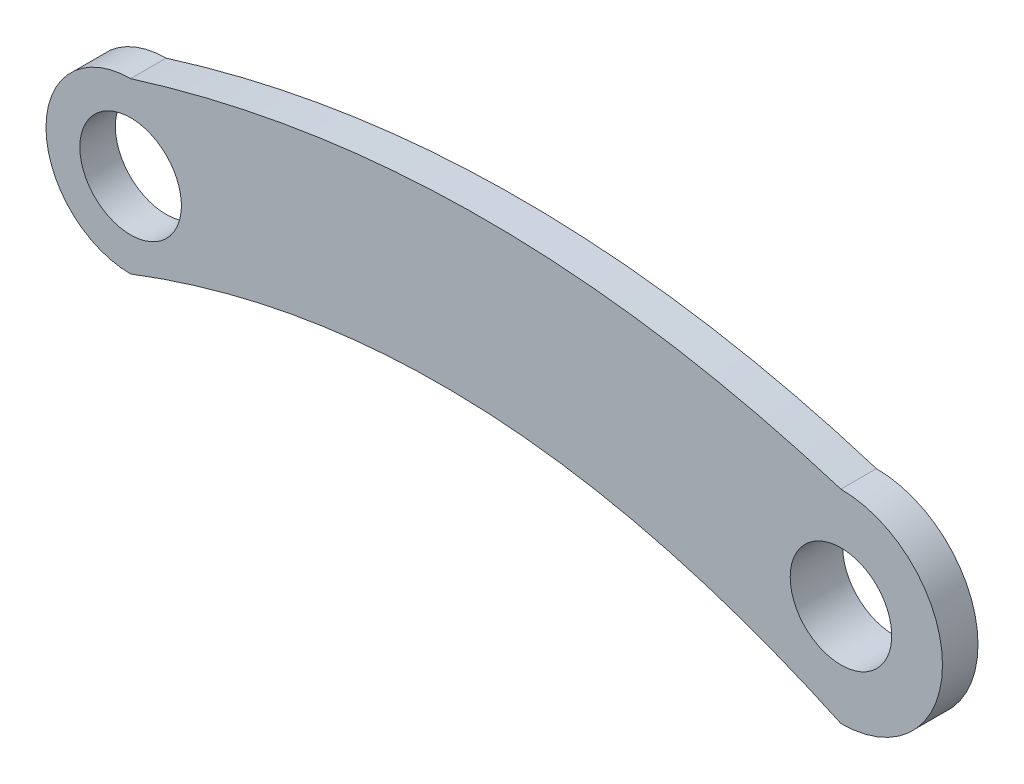
ISO-10303-21;
HEADER;
FILE_DESCRIPTION(('STEP AP214'),'2;1');
FILE_NAME('part.step','',(''),(''),'','','');
FILE_SCHEMA(('AUTOMOTIVE_DESIGN { 1 0 10303 214 1 1 1 1 }'));
ENDSEC;
DATA;
#1=APPLICATION_CONTEXT('core data for automotive mechanical design processes');
#2=APPLICATION_PROTOCOL_DEFINITION('international standard','automotive_design',2000,#1);
#3=PRODUCT_CONTEXT('',#1,'mechanical');
#4=PRODUCT('Part','Part','',(#3));
#5=PRODUCT_RELATED_PRODUCT_CATEGORY('part','',(#4));
#6=PRODUCT_DEFINITION_FORMATION('','',#4);
#7=PRODUCT_DEFINITION_CONTEXT('part definition',#1,'design');
#8=PRODUCT_DEFINITION('design','',#6,#7);
#9=PRODUCT_DEFINITION_SHAPE('','',#8);
#10=(LENGTH_UNIT() NAMED_UNIT(*) SI_UNIT(.MILLI.,.METRE.));
#11=(NAMED_UNIT(*) PLANE_ANGLE_UNIT() SI_UNIT($,.RADIAN.));
#12=(NAMED_UNIT(*) SI_UNIT($,.STERADIAN.) SOLID_ANGLE_UNIT());
#13=UNCERTAINTY_MEASURE_WITH_UNIT(LENGTH_MEASURE(1.E-05),#10,'distance_accuracy_value','');
#14=(GEOMETRIC_REPRESENTATION_CONTEXT(3) GLOBAL_UNCERTAINTY_ASSIGNED_CONTEXT((#13)) GLOBAL_UNIT_ASSIGNED_CONTEXT((#10,
#11,#12)) REPRESENTATION_CONTEXT('',''));
#15=CARTESIAN_POINT('',(0.,0.,0.));
#16=DIRECTION('',(0.,0.,1.));
#17=DIRECTION('',(1.,0.,0.));
#18=AXIS2_PLACEMENT_3D('',#15,#16,#17);
#19=CARTESIAN_POINT('',(0.,0.,0.));
#20=DIRECTION('',(0.,0.,1.));
#21=DIRECTION('',(1.,0.,0.));
#22=AXIS2_PLACEMENT_3D('',#19,#20,#21);
#23=PLANE('',#22);
#24=CARTESIAN_POINT('',(-267.733324074029,336.480114093346,0.));
#25=DIRECTION('',(0.,0.,1.));
#26=DIRECTION('',(1.,0.,0.));
#27=AXIS2_PLACEMENT_3D('',#24,#25,#26);
#28=CIRCLE('',#27,50.);
#29=CARTESIAN_POINT('',(-267.733324074029,386.480114093346,0.));
#30=VERTEX_POINT('',#29);
#31=CARTESIAN_POINT('',(-267.733324074029,286.480114093346,0.));
#32=VERTEX_POINT('',#31);
#33=EDGE_CURVE('E126',#30,#32,#28,.T.);
#34=ORIENTED_EDGE('',*,*,#33,.F.);
#35=CARTESIAN_POINT('',(-267.733324074029,386.480114093346,0.));
#36=CARTESIAN_POINT('',(-58.3768927784346,451.865914160474,0.));
#37=CARTESIAN_POINT('',(152.142574226651,386.270803333194,0.));
#38=B_SPLINE_CURVE_WITH_KNOTS('',2,(#35,#36,#37),.UNSPECIFIED.,.F.,.F.,(3,3),(0.,1.),.UNSPECIFIED.);
#39=CARTESIAN_POINT('',(152.142574226651,386.270803333198,0.));
#40=VERTEX_POINT('',#39);
#41=EDGE_CURVE('E194',#30,#40,#38,.T.);
#42=ORIENTED_EDGE('',*,*,#41,.T.);
#43=CARTESIAN_POINT('',(152.142574226651,326.270803333194,0.));
#44=DIRECTION('',(0.,0.,1.));
#45=DIRECTION('',(1.,0.,0.));
#46=AXIS2_PLACEMENT_3D('',#43,#44,#45);
#47=CIRCLE('',#46,60.0000000000038);
#48=CARTESIAN_POINT('',(152.142574226651,266.27080333319,0.));
#49=VERTEX_POINT('',#48);
#50=EDGE_CURVE('E196',#40,#49,#47,.F.);
#51=ORIENTED_EDGE('',*,*,#50,.T.);
#52=CARTESIAN_POINT('',(-267.733324074029,286.480114093346,0.));
#53=CARTESIAN_POINT('',(-61.5362998778427,365.75863406684,0.));
#54=CARTESIAN_POINT('',(152.142574226651,266.270803333194,0.));
#55=B_SPLINE_CURVE_WITH_KNOTS('',2,(#52,#53,#54),.UNSPECIFIED.,.F.,.F.,(3,3),(0.,1.),.UNSPECIFIED.);
#56=EDGE_CURVE('E107',#32,#49,#55,.T.);
#57=ORIENTED_EDGE('',*,*,#56,.F.);
#58=EDGE_LOOP('',(#34,#42,#51,#57));
#59=FACE_BOUND('',#58,.T.);
#60=CARTESIAN_POINT('',(-267.733324074029,336.480114093346,0.));
#61=DIRECTION('',(0.,0.,1.));
#62=DIRECTION('',(1.,0.,0.));
#63=AXIS2_PLACEMENT_3D('',#60,#61,#62);
#64=CIRCLE('',#63,30.);
#65=CARTESIAN_POINT('',(-297.733324074029,336.480114093346,0.));
#66=VERTEX_POINT('',#65);
#67=EDGE_CURVE('E151',#66,#66,#64,.T.);
#68=ORIENTED_EDGE('',*,*,#67,.T.);
#69=EDGE_LOOP('',(#68));
#70=FACE_BOUND('',#69,.T.);
#71=CARTESIAN_POINT('',(152.142574226651,326.270803333194,0.));
#72=DIRECTION('',(0.,0.,1.));
#73=DIRECTION('',(1.,0.,0.));
#74=AXIS2_PLACEMENT_3D('',#71,#72,#73);
#75=CIRCLE('',#74,40.);
#76=CARTESIAN_POINT('',(192.142574226651,326.270803333194,0.));
#77=VERTEX_POINT('',#76);
#78=EDGE_CURVE('E11',#77,#77,#75,.F.);
#79=ORIENTED_EDGE('',*,*,#78,.F.);
#80=EDGE_LOOP('',(#79));
#81=FACE_BOUND('',#80,.T.);
#82=ADVANCED_FACE('F47',(#59,#70,#81),#23,.F.);
#83=CARTESIAN_POINT('',(-267.733324074029,336.480114093346,21.));
#84=DIRECTION('',(0.,0.,-1.));
#85=DIRECTION('',(-1.,0.,0.));
#86=AXIS2_PLACEMENT_3D('',#83,#84,#85);
#87=CYLINDRICAL_SURFACE('',#86,50.);
#88=ORIENTED_EDGE('',*,*,#33,.T.);
#89=DIRECTION('',(0.,0.,-1.));
#90=VECTOR('',#89,1.);
#91=CARTESIAN_POINT('',(-267.733324074029,286.480114093346,21.));
#92=LINE('',#91,#90);
#93=CARTESIAN_POINT('',(-267.733324074029,286.480114093346,21.));
#94=VERTEX_POINT('',#93);
#95=EDGE_CURVE('E56',#94,#32,#92,.T.);
#96=ORIENTED_EDGE('',*,*,#95,.F.);
#97=CARTESIAN_POINT('',(-267.733324074029,336.480114093346,21.));
#98=DIRECTION('',(0.,0.,1.));
#99=DIRECTION('',(1.,0.,0.));
#100=AXIS2_PLACEMENT_3D('',#97,#98,#99);
#101=CIRCLE('',#100,50.);
#102=CARTESIAN_POINT('',(-267.733324074029,386.480114093346,21.));
#103=VERTEX_POINT('',#102);
#104=EDGE_CURVE('E101',#103,#94,#101,.T.);
#105=ORIENTED_EDGE('',*,*,#104,.F.);
#106=DIRECTION('',(0.,0.,-1.));
#107=VECTOR('',#106,1.);
#108=CARTESIAN_POINT('',(-267.733324074029,386.480114093346,21.));
#109=LINE('',#108,#107);
#110=EDGE_CURVE('E70',#103,#30,#109,.T.);
#111=ORIENTED_EDGE('',*,*,#110,.T.);
#112=EDGE_LOOP('',(#88,#96,#105,#111));
#113=FACE_BOUND('',#112,.T.);
#114=ADVANCED_FACE('F51',(#113),#87,.T.);
#115=CARTESIAN_POINT('',(-267.733324074029,286.480114093346,21.));
#116=CARTESIAN_POINT('',(-61.5362998778427,365.75863406684,21.));
#117=CARTESIAN_POINT('',(152.142574226651,266.270803333194,21.));
#118=B_SPLINE_CURVE_WITH_KNOTS('',2,(#115,#116,#117),.UNSPECIFIED.,.F.,.F.,(3,3),(0.,1.),.UNSPECIFIED.);
#119=DIRECTION('',(0.,0.,-1.));
#120=VECTOR('',#119,1.);
#121=SURFACE_OF_LINEAR_EXTRUSION('',#118,#120);
#122=ORIENTED_EDGE('',*,*,#56,.T.);
#123=DIRECTION('',(0.,0.,-1.));
#124=VECTOR('',#123,1.);
#125=CARTESIAN_POINT('',(152.142574226651,266.27080333319,21.));
#126=LINE('',#125,#124);
#127=CARTESIAN_POINT('',(152.142574226651,266.27080333319,21.));
#128=VERTEX_POINT('',#127);
#129=EDGE_CURVE('E106',#128,#49,#126,.T.);
#130=ORIENTED_EDGE('',*,*,#129,.F.);
#131=EDGE_CURVE('E91',#94,#128,#118,.T.);
#132=ORIENTED_EDGE('',*,*,#131,.F.);
#133=ORIENTED_EDGE('',*,*,#95,.T.);
#134=EDGE_LOOP('',(#122,#130,#132,#133));
#135=FACE_BOUND('',#134,.T.);
#136=ADVANCED_FACE('F110',(#135),#121,.F.);
#137=CARTESIAN_POINT('',(152.142574226651,326.270803333194,21.));
#138=DIRECTION('',(0.,0.,-1.));
#139=DIRECTION('',(-1.,0.,0.));
#140=AXIS2_PLACEMENT_3D('',#137,#138,#139);
#141=CYLINDRICAL_SURFACE('',#140,60.0000000000038);
#142=ORIENTED_EDGE('',*,*,#50,.F.);
#143=DIRECTION('',(0.,0.,-1.));
#144=VECTOR('',#143,1.);
#145=CARTESIAN_POINT('',(152.142574226651,386.270803333198,21.));
#146=LINE('',#145,#144);
#147=CARTESIAN_POINT('',(152.142574226651,386.270803333198,21.));
#148=VERTEX_POINT('',#147);
#149=EDGE_CURVE('E83',#148,#40,#146,.T.);
#150=ORIENTED_EDGE('',*,*,#149,.F.);
#151=CARTESIAN_POINT('',(152.142574226651,326.270803333194,21.));
#152=DIRECTION('',(0.,0.,1.));
#153=DIRECTION('',(1.,0.,0.));
#154=AXIS2_PLACEMENT_3D('',#151,#152,#153);
#155=CIRCLE('',#154,60.0000000000038);
#156=EDGE_CURVE('E99',#148,#128,#155,.F.);
#157=ORIENTED_EDGE('',*,*,#156,.T.);
#158=ORIENTED_EDGE('',*,*,#129,.T.);
#159=EDGE_LOOP('',(#142,#150,#157,#158));
#160=FACE_BOUND('',#159,.T.);
#161=ADVANCED_FACE('F114',(#160),#141,.T.);
#162=CARTESIAN_POINT('',(-267.733324074029,386.480114093346,21.));
#163=CARTESIAN_POINT('',(-58.3768927784346,451.865914160474,21.));
#164=CARTESIAN_POINT('',(152.142574226651,386.270803333194,21.));
#165=B_SPLINE_CURVE_WITH_KNOTS('',2,(#162,#163,#164),.UNSPECIFIED.,.F.,.F.,(3,3),(0.,1.),.UNSPECIFIED.);
#166=DIRECTION('',(0.,0.,-1.));
#167=VECTOR('',#166,1.);
#168=SURFACE_OF_LINEAR_EXTRUSION('',#165,#167);
#169=ORIENTED_EDGE('',*,*,#41,.F.);
#170=ORIENTED_EDGE('',*,*,#110,.F.);
#171=EDGE_CURVE('E113',#103,#148,#165,.T.);
#172=ORIENTED_EDGE('',*,*,#171,.T.);
#173=ORIENTED_EDGE('',*,*,#149,.T.);
#174=EDGE_LOOP('',(#169,#170,#172,#173));
#175=FACE_BOUND('',#174,.T.);
#176=ADVANCED_FACE('F133',(#175),#168,.T.);
#177=CARTESIAN_POINT('',(0.,0.,21.));
#178=DIRECTION('',(0.,0.,1.));
#179=DIRECTION('',(1.,0.,0.));
#180=AXIS2_PLACEMENT_3D('',#177,#178,#179);
#181=PLANE('',#180);
#182=CARTESIAN_POINT('',(-267.733324074029,336.480114093346,21.));
#183=DIRECTION('',(0.,0.,1.));
#184=DIRECTION('',(1.,0.,0.));
#185=AXIS2_PLACEMENT_3D('',#182,#183,#184);
#186=CIRCLE('',#185,30.);
#187=CARTESIAN_POINT('',(-297.733324074029,336.480114093346,21.));
#188=VERTEX_POINT('',#187);
#189=EDGE_CURVE('E176',#188,#188,#186,.T.);
#190=ORIENTED_EDGE('',*,*,#189,.F.);
#191=EDGE_LOOP('',(#190));
#192=FACE_BOUND('',#191,.T.);
#193=CARTESIAN_POINT('',(152.142574226651,326.270803333194,21.));
#194=DIRECTION('',(0.,0.,1.));
#195=DIRECTION('',(1.,0.,0.));
#196=AXIS2_PLACEMENT_3D('',#193,#194,#195);
#197=CIRCLE('',#196,30.);
#198=CARTESIAN_POINT('',(122.142574226651,326.270803333194,21.));
#199=VERTEX_POINT('',#198);
#200=EDGE_CURVE('E182',#199,#199,#197,.T.);
#201=ORIENTED_EDGE('',*,*,#200,.F.);
#202=EDGE_LOOP('',(#201));
#203=FACE_BOUND('',#202,.T.);
#204=ORIENTED_EDGE('',*,*,#104,.T.);
#205=ORIENTED_EDGE('',*,*,#131,.T.);
#206=ORIENTED_EDGE('',*,*,#156,.F.);
#207=ORIENTED_EDGE('',*,*,#171,.F.);
#208=EDGE_LOOP('',(#204,#205,#206,#207));
#209=FACE_BOUND('',#208,.T.);
#210=ADVANCED_FACE('F100',(#192,#203,#209),#181,.T.);
#211=CARTESIAN_POINT('',(152.142574226651,326.270803333194,21.));
#212=DIRECTION('',(0.,0.,-1.));
#213=DIRECTION('',(-1.,0.,0.));
#214=AXIS2_PLACEMENT_3D('',#211,#212,#213);
#215=CYLINDRICAL_SURFACE('',#214,30.);
#216=CARTESIAN_POINT('',(152.142574226651,326.270803333194,-10.));
#217=DIRECTION('',(0.,0.,-1.));
#218=DIRECTION('',(-1.,0.,0.));
#219=AXIS2_PLACEMENT_3D('',#216,#217,#218);
#220=CIRCLE('',#219,30.);
#221=CARTESIAN_POINT('',(122.142574226651,326.270803333194,-10.));
#222=VERTEX_POINT('',#221);
#223=EDGE_CURVE('E190',#222,#222,#220,.T.);
#224=CARTESIAN_POINT('',(122.142574226651,326.270803333194,21.));
#225=CARTESIAN_POINT('',(122.142574226651,326.270803333194,20.6770833333333));
#226=CARTESIAN_POINT('',(122.142574226651,326.270803333194,20.3541666666667));
#227=CARTESIAN_POINT('',(122.142574226651,326.270803333194,19.7083333333333));
#228=CARTESIAN_POINT('',(122.142574226651,326.270803333194,19.3854166666667));
#229=CARTESIAN_POINT('',(122.142574226651,326.270803333194,18.7395833333333));
#230=CARTESIAN_POINT('',(122.142574226651,326.270803333194,18.4166666666667));
#231=CARTESIAN_POINT('',(122.142574226651,326.270803333194,17.7708333333333));
#232=CARTESIAN_POINT('',(122.142574226651,326.270803333194,17.4479166666667));
#233=CARTESIAN_POINT('',(122.142574226651,326.270803333194,16.8020833333333));
#234=CARTESIAN_POINT('',(122.142574226651,326.270803333194,16.4791666666667));
#235=CARTESIAN_POINT('',(122.142574226651,326.270803333194,15.8333333333333));
#236=CARTESIAN_POINT('',(122.142574226651,326.270803333194,15.5104166666667));
#237=CARTESIAN_POINT('',(122.142574226651,326.270803333194,14.8645833333333));
#238=CARTESIAN_POINT('',(122.142574226651,326.270803333194,14.5416666666667));
#239=CARTESIAN_POINT('',(122.142574226651,326.270803333194,13.8958333333333));
#240=CARTESIAN_POINT('',(122.142574226651,326.270803333194,13.5729166666667));
#241=CARTESIAN_POINT('',(122.142574226651,326.270803333194,12.9270833333333));
#242=CARTESIAN_POINT('',(122.142574226651,326.270803333194,12.6041666666667));
#243=CARTESIAN_POINT('',(122.142574226651,326.270803333194,11.9583333333333));
#244=CARTESIAN_POINT('',(122.142574226651,326.270803333194,11.6354166666667));
#245=CARTESIAN_POINT('',(122.142574226651,326.270803333194,10.9895833333333));
#246=CARTESIAN_POINT('',(122.142574226651,326.270803333194,10.6666666666667));
#247=CARTESIAN_POINT('',(122.142574226651,326.270803333194,10.0208333333333));
#248=CARTESIAN_POINT('',(122.142574226651,326.270803333194,9.69791666666667));
#249=CARTESIAN_POINT('',(122.142574226651,326.270803333194,9.05208333333333));
#250=CARTESIAN_POINT('',(122.142574226651,326.270803333194,8.72916666666666));
#251=CARTESIAN_POINT('',(122.142574226651,326.270803333194,8.08333333333333));
#252=CARTESIAN_POINT('',(122.142574226651,326.270803333194,7.76041666666666));
#253=CARTESIAN_POINT('',(122.142574226651,326.270803333194,7.11458333333333));
#254=CARTESIAN_POINT('',(122.142574226651,326.270803333194,6.79166666666667));
#255=CARTESIAN_POINT('',(122.142574226651,326.270803333194,6.14583333333333));
#256=CARTESIAN_POINT('',(122.142574226651,326.270803333194,5.82291666666666));
#257=CARTESIAN_POINT('',(122.142574226651,326.270803333194,5.17708333333333));
#258=CARTESIAN_POINT('',(122.142574226651,326.270803333194,4.85416666666667));
#259=CARTESIAN_POINT('',(122.142574226651,326.270803333194,4.20833333333333));
#260=CARTESIAN_POINT('',(122.142574226651,326.270803333194,3.88541666666667));
#261=CARTESIAN_POINT('',(122.142574226651,326.270803333194,3.23958333333333));
#262=CARTESIAN_POINT('',(122.142574226651,326.270803333194,2.91666666666667));
#263=CARTESIAN_POINT('',(122.142574226651,326.270803333194,2.27083333333334));
#264=CARTESIAN_POINT('',(122.142574226651,326.270803333194,1.94791666666667));
#265=CARTESIAN_POINT('',(122.142574226651,326.270803333194,1.30208333333333));
#266=CARTESIAN_POINT('',(122.142574226651,326.270803333194,0.979166666666668));
#267=CARTESIAN_POINT('',(122.142574226651,326.270803333194,0.333333333333334));
#268=CARTESIAN_POINT('',(122.142574226651,326.270803333194,0.0104166666666667));
#269=CARTESIAN_POINT('',(122.142574226651,326.270803333194,-0.635416666666667));
#270=CARTESIAN_POINT('',(122.142574226651,326.270803333194,-0.958333333333334));
#271=CARTESIAN_POINT('',(122.142574226651,326.270803333194,-1.60416666666667));
#272=CARTESIAN_POINT('',(122.142574226651,326.270803333194,-1.92708333333334));
#273=CARTESIAN_POINT('',(122.142574226651,326.270803333194,-2.57291666666667));
#274=CARTESIAN_POINT('',(122.142574226651,326.270803333194,-2.89583333333333));
#275=CARTESIAN_POINT('',(122.142574226651,326.270803333194,-3.54166666666667));
#276=CARTESIAN_POINT('',(122.142574226651,326.270803333194,-3.86458333333333));
#277=CARTESIAN_POINT('',(122.142574226651,326.270803333194,-4.51041666666667));
#278=CARTESIAN_POINT('',(122.142574226651,326.270803333194,-4.83333333333333));
#279=CARTESIAN_POINT('',(122.142574226651,326.270803333194,-5.47916666666667));
#280=CARTESIAN_POINT('',(122.142574226651,326.270803333194,-5.80208333333334));
#281=CARTESIAN_POINT('',(122.142574226651,326.270803333194,-6.44791666666667));
#282=CARTESIAN_POINT('',(122.142574226651,326.270803333194,-6.77083333333334));
#283=CARTESIAN_POINT('',(122.142574226651,326.270803333194,-7.41666666666667));
#284=CARTESIAN_POINT('',(122.142574226651,326.270803333194,-7.73958333333333));
#285=CARTESIAN_POINT('',(122.142574226651,326.270803333194,-8.38541666666667));
#286=CARTESIAN_POINT('',(122.142574226651,326.270803333194,-8.70833333333333));
#287=CARTESIAN_POINT('',(122.142574226651,326.270803333194,-9.35416666666667));
#288=CARTESIAN_POINT('',(122.142574226651,326.270803333194,-9.67708333333333));
#289=CARTESIAN_POINT('',(122.142574226651,326.270803333194,-10.));
#290=B_SPLINE_CURVE_WITH_KNOTS('',3,(#224,#225,#226,#227,#228,#229,#230,#231,#232,#233,#234,
#235,#236,#237,#238,#239,#240,#241,#242,#243,#244,#245,#246,#247,#248,#249,#250,#251,#252,#253,
#254,#255,#256,#257,#258,#259,#260,#261,#262,#263,#264,#265,#266,#267,#268,#269,#270,#271,#272,
#273,#274,#275,#276,#277,#278,#279,#280,#281,#282,#283,#284,#285,#286,#287,#288,#289),
.UNSPECIFIED.,.F.,.F.,(4,2,2,2,2,2,2,2,2,2,2,2,2,2,2,2,2,2,2,2,2,2,2,2,2,2,2,2,2,2,2,2,4),(0.,
0.968750000000001,1.9375,2.90625,3.875,4.84375,5.8125,6.78125,7.75,8.71875,9.6875,10.65625,
11.625,12.59375,13.5625,14.53125,15.5,16.46875,17.4375,18.40625,19.375,20.34375,21.3125,
22.28125,23.25,24.21875,25.1875,26.15625,27.125,28.09375,29.0625,30.03125,31.),.UNSPECIFIED.);
#291=EDGE_CURVE('BSEAM169',#199,#222,#290,.T.);
#292=ORIENTED_EDGE('',*,*,#200,.T.);
#293=ORIENTED_EDGE('',*,*,#223,.T.);
#294=ORIENTED_EDGE('',*,*,#291,.T.);
#295=ORIENTED_EDGE('',*,*,#291,.F.);
#296=EDGE_LOOP('',(#292,#294,#293,#295));
#297=FACE_BOUND('',#296,.T.);
#298=ADVANCED_FACE('F169',(#297),#215,.F.);
#299=CARTESIAN_POINT('',(-267.733324074029,336.480114093346,21.));
#300=DIRECTION('',(0.,0.,-1.));
#301=DIRECTION('',(-1.,0.,0.));
#302=AXIS2_PLACEMENT_3D('',#299,#300,#301);
#303=CYLINDRICAL_SURFACE('',#302,30.);
#304=CARTESIAN_POINT('',(-297.733324074029,336.480114093346,21.));
#305=CARTESIAN_POINT('',(-297.733324074029,336.480114093346,20.78125));
#306=CARTESIAN_POINT('',(-297.733324074029,336.480114093346,20.5625));
#307=CARTESIAN_POINT('',(-297.733324074029,336.480114093346,20.125));
#308=CARTESIAN_POINT('',(-297.733324074029,336.480114093346,19.90625));
#309=CARTESIAN_POINT('',(-297.733324074029,336.480114093346,19.46875));
#310=CARTESIAN_POINT('',(-297.733324074029,336.480114093346,19.25));
#311=CARTESIAN_POINT('',(-297.733324074029,336.480114093346,18.8125));
#312=CARTESIAN_POINT('',(-297.733324074029,336.480114093346,18.59375));
#313=CARTESIAN_POINT('',(-297.733324074029,336.480114093346,18.15625));
#314=CARTESIAN_POINT('',(-297.733324074029,336.480114093346,17.9375));
#315=CARTESIAN_POINT('',(-297.733324074029,336.480114093346,17.5));
#316=CARTESIAN_POINT('',(-297.733324074029,336.480114093346,17.28125));
#317=CARTESIAN_POINT('',(-297.733324074029,336.480114093346,16.84375));
#318=CARTESIAN_POINT('',(-297.733324074029,336.480114093346,16.625));
#319=CARTESIAN_POINT('',(-297.733324074029,336.480114093346,16.1875));
#320=CARTESIAN_POINT('',(-297.733324074029,336.480114093346,15.96875));
#321=CARTESIAN_POINT('',(-297.733324074029,336.480114093346,15.53125));
#322=CARTESIAN_POINT('',(-297.733324074029,336.480114093346,15.3125));
#323=CARTESIAN_POINT('',(-297.733324074029,336.480114093346,14.875));
#324=CARTESIAN_POINT('',(-297.733324074029,336.480114093346,14.65625));
#325=CARTESIAN_POINT('',(-297.733324074029,336.480114093346,14.21875));
#326=CARTESIAN_POINT('',(-297.733324074029,336.480114093346,14.));
#327=CARTESIAN_POINT('',(-297.733324074029,336.480114093346,13.5625));
#328=CARTESIAN_POINT('',(-297.733324074029,336.480114093346,13.34375));
#329=CARTESIAN_POINT('',(-297.733324074029,336.480114093346,12.90625));
#330=CARTESIAN_POINT('',(-297.733324074029,336.480114093346,12.6875));
#331=CARTESIAN_POINT('',(-297.733324074029,336.480114093346,12.25));
#332=CARTESIAN_POINT('',(-297.733324074029,336.480114093346,12.03125));
#333=CARTESIAN_POINT('',(-297.733324074029,336.480114093346,11.59375));
#334=CARTESIAN_POINT('',(-297.733324074029,336.480114093346,11.375));
#335=CARTESIAN_POINT('',(-297.733324074029,336.480114093346,10.9375));
#336=CARTESIAN_POINT('',(-297.733324074029,336.480114093346,10.71875));
#337=CARTESIAN_POINT('',(-297.733324074029,336.480114093346,10.28125));
#338=CARTESIAN_POINT('',(-297.733324074029,336.480114093346,10.0625));
#339=CARTESIAN_POINT('',(-297.733324074029,336.480114093346,9.625));
#340=CARTESIAN_POINT('',(-297.733324074029,336.480114093346,9.40625));
#341=CARTESIAN_POINT('',(-297.733324074029,336.480114093346,8.96875));
#342=CARTESIAN_POINT('',(-297.733324074029,336.480114093346,8.75));
#343=CARTESIAN_POINT('',(-297.733324074029,336.480114093346,8.3125));
#344=CARTESIAN_POINT('',(-297.733324074029,336.480114093346,8.09375));
#345=CARTESIAN_POINT('',(-297.733324074029,336.480114093346,7.65625));
#346=CARTESIAN_POINT('',(-297.733324074029,336.480114093346,7.4375));
#347=CARTESIAN_POINT('',(-297.733324074029,336.480114093346,7.));
#348=CARTESIAN_POINT('',(-297.733324074029,336.480114093346,6.78125));
#349=CARTESIAN_POINT('',(-297.733324074029,336.480114093346,6.34375));
#350=CARTESIAN_POINT('',(-297.733324074029,336.480114093346,6.125));
#351=CARTESIAN_POINT('',(-297.733324074029,336.480114093346,5.6875));
#352=CARTESIAN_POINT('',(-297.733324074029,336.480114093346,5.46875));
#353=CARTESIAN_POINT('',(-297.733324074029,336.480114093346,5.03125));
#354=CARTESIAN_POINT('',(-297.733324074029,336.480114093346,4.8125));
#355=CARTESIAN_POINT('',(-297.733324074029,336.480114093346,4.375));
#356=CARTESIAN_POINT('',(-297.733324074029,336.480114093346,4.15625));
#357=CARTESIAN_POINT('',(-297.733324074029,336.480114093346,3.71875));
#358=CARTESIAN_POINT('',(-297.733324074029,336.480114093346,3.5));
#359=CARTESIAN_POINT('',(-297.733324074029,336.480114093346,3.0625));
#360=CARTESIAN_POINT('',(-297.733324074029,336.480114093346,2.84375));
#361=CARTESIAN_POINT('',(-297.733324074029,336.480114093346,2.40625));
#362=CARTESIAN_POINT('',(-297.733324074029,336.480114093346,2.1875));
#363=CARTESIAN_POINT('',(-297.733324074029,336.480114093346,1.75));
#364=CARTESIAN_POINT('',(-297.733324074029,336.480114093346,1.53125));
#365=CARTESIAN_POINT('',(-297.733324074029,336.480114093346,1.09375));
#366=CARTESIAN_POINT('',(-297.733324074029,336.480114093346,0.875000000000001));
#367=CARTESIAN_POINT('',(-297.733324074029,336.480114093346,0.4375));
#368=CARTESIAN_POINT('',(-297.733324074029,336.480114093346,0.21875));
#369=CARTESIAN_POINT('',(-297.733324074029,336.480114093346,0.));
#370=B_SPLINE_CURVE_WITH_KNOTS('',3,(#304,#305,#306,#307,#308,#309,#310,#311,#312,#313,#314,
#315,#316,#317,#318,#319,#320,#321,#322,#323,#324,#325,#326,#327,#328,#329,#330,#331,#332,#333,
#334,#335,#336,#337,#338,#339,#340,#341,#342,#343,#344,#345,#346,#347,#348,#349,#350,#351,#352,
#353,#354,#355,#356,#357,#358,#359,#360,#361,#362,#363,#364,#365,#366,#367,#368,#369),
.UNSPECIFIED.,.F.,.F.,(4,2,2,2,2,2,2,2,2,2,2,2,2,2,2,2,2,2,2,2,2,2,2,2,2,2,2,2,2,2,2,2,4),(0.,
0.656249999999997,1.3125,1.96875,2.625,3.28125,3.9375,4.59375,5.25,5.90625,6.5625,7.21875,7.875,
8.53125,9.1875,9.84375,10.5,11.15625,11.8125,12.46875,13.125,13.78125,14.4375,15.09375,15.75,
16.40625,17.0625,17.71875,18.375,19.03125,19.6875,20.34375,21.),.UNSPECIFIED.);
#371=EDGE_CURVE('BSEAM161',#188,#66,#370,.T.);
#372=ORIENTED_EDGE('',*,*,#189,.T.);
#373=ORIENTED_EDGE('',*,*,#67,.F.);
#374=ORIENTED_EDGE('',*,*,#371,.T.);
#375=ORIENTED_EDGE('',*,*,#371,.F.);
#376=EDGE_LOOP('',(#372,#374,#373,#375));
#377=FACE_BOUND('',#376,.T.);
#378=ADVANCED_FACE('F161',(#377),#303,.F.);
#379=CARTESIAN_POINT('',(152.142574226651,326.270803333194,-10.));
#380=DIRECTION('',(0.,0.,-1.));
#381=DIRECTION('',(-1.,0.,0.));
#382=AXIS2_PLACEMENT_3D('',#379,#380,#381);
#383=PLANE('',#382);
#384=CARTESIAN_POINT('',(152.142574226651,326.270803333194,-10.));
#385=DIRECTION('',(0.,0.,-1.));
#386=DIRECTION('',(-1.,0.,0.));
#387=AXIS2_PLACEMENT_3D('',#384,#385,#386);
#388=CIRCLE('',#387,40.);
#389=CARTESIAN_POINT('',(112.142574226651,326.270803333194,-10.));
#390=VERTEX_POINT('',#389);
#391=EDGE_CURVE('E181',#390,#390,#388,.T.);
#392=ORIENTED_EDGE('',*,*,#391,.T.);
#393=EDGE_LOOP('',(#392));
#394=FACE_BOUND('',#393,.T.);
#395=ORIENTED_EDGE('',*,*,#223,.F.);
#396=EDGE_LOOP('',(#395));
#397=FACE_BOUND('',#396,.T.);
#398=ADVANCED_FACE('F156',(#394,#397),#383,.T.);
#399=CARTESIAN_POINT('',(152.142574226651,326.270803333194,-10.));
#400=DIRECTION('',(0.,0.,1.));
#401=DIRECTION('',(1.,0.,0.));
#402=AXIS2_PLACEMENT_3D('',#399,#400,#401);
#403=CYLINDRICAL_SURFACE('',#402,40.);
#404=ORIENTED_EDGE('',*,*,#391,.F.);
#405=EDGE_LOOP('',(#404));
#406=FACE_BOUND('',#405,.T.);
#407=ORIENTED_EDGE('',*,*,#78,.T.);
#408=EDGE_LOOP('',(#407));
#409=FACE_BOUND('',#408,.T.);
#410=ADVANCED_FACE('F152',(#406,#409),#403,.T.);
#411=CLOSED_SHELL('',(#82,#114,#136,#161,#176,#210,#298,#378,#398,#410));
#412=MANIFOLD_SOLID_BREP('B2',#411);
#413=ADVANCED_BREP_SHAPE_REPRESENTATION('',(#18,#412),#14);
#414=SHAPE_DEFINITION_REPRESENTATION(#9,#413);
ENDSEC;
END-ISO-10303-21;
